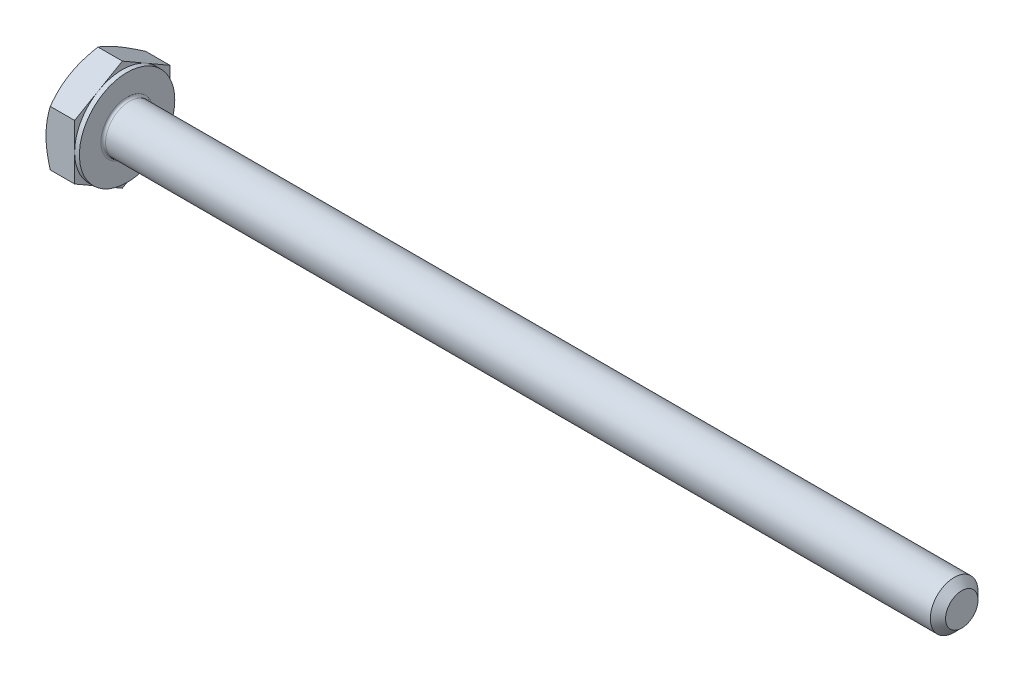
ISO-10303-21;
HEADER;
FILE_DESCRIPTION(('STEP AP214'),'2;1');
FILE_NAME('part.step','',(''),(''),'','','');
FILE_SCHEMA(('AUTOMOTIVE_DESIGN { 1 0 10303 214 1 1 1 1 }'));
ENDSEC;
DATA;
#1=APPLICATION_CONTEXT('core data for automotive mechanical design processes');
#2=APPLICATION_PROTOCOL_DEFINITION('international standard','automotive_design',2000,#1);
#3=PRODUCT_CONTEXT('',#1,'mechanical');
#4=PRODUCT('Part','Part','',(#3));
#5=PRODUCT_RELATED_PRODUCT_CATEGORY('part','',(#4));
#6=PRODUCT_DEFINITION_FORMATION('','',#4);
#7=PRODUCT_DEFINITION_CONTEXT('part definition',#1,'design');
#8=PRODUCT_DEFINITION('design','',#6,#7);
#9=PRODUCT_DEFINITION_SHAPE('','',#8);
#10=(LENGTH_UNIT() NAMED_UNIT(*) SI_UNIT(.MILLI.,.METRE.));
#11=(NAMED_UNIT(*) PLANE_ANGLE_UNIT() SI_UNIT($,.RADIAN.));
#12=(NAMED_UNIT(*) SI_UNIT($,.STERADIAN.) SOLID_ANGLE_UNIT());
#13=UNCERTAINTY_MEASURE_WITH_UNIT(LENGTH_MEASURE(1.E-05),#10,'distance_accuracy_value','');
#14=(GEOMETRIC_REPRESENTATION_CONTEXT(3) GLOBAL_UNCERTAINTY_ASSIGNED_CONTEXT((#13)) GLOBAL_UNIT_ASSIGNED_CONTEXT((#10,
#11,#12)) REPRESENTATION_CONTEXT('',''));
#15=CARTESIAN_POINT('',(0.,0.,0.));
#16=DIRECTION('',(0.,0.,1.));
#17=DIRECTION('',(1.,0.,0.));
#18=AXIS2_PLACEMENT_3D('',#15,#16,#17);
#19=CARTESIAN_POINT('',(1.4,1.15470053837925,-2.));
#20=DIRECTION('',(0.,-0.866025403784438,0.500000000000001));
#21=DIRECTION('',(0.,-0.500000000000001,-0.866025403784438));
#22=AXIS2_PLACEMENT_3D('',#19,#20,#21);
#23=PLANE('',#22);
#24=DIRECTION('',(0.,0.500000000000001,0.866025403784438));
#25=VECTOR('',#24,1.);
#26=CARTESIAN_POINT('',(1.2,1.15470053837925,-2.));
#27=LINE('',#26,#25);
#28=CARTESIAN_POINT('',(1.2,1.15470053837925,-2.));
#29=VERTEX_POINT('',#28);
#30=CARTESIAN_POINT('',(1.2,1.73205080756887,-1.));
#31=VERTEX_POINT('',#30);
#32=EDGE_CURVE('E174',#29,#31,#27,.T.);
#33=ORIENTED_EDGE('',*,*,#32,.F.);
#34=DIRECTION('',(-1.,0.,0.));
#35=VECTOR('',#34,1.);
#36=CARTESIAN_POINT('',(1.4,1.15470053837925,-2.));
#37=LINE('',#36,#35);
#38=CARTESIAN_POINT('',(0.178632794954079,1.15470053837925,-2.));
#39=VERTEX_POINT('',#38);
#40=EDGE_CURVE('E302',#29,#39,#37,.T.);
#41=ORIENTED_EDGE('',*,*,#40,.T.);
#42=CARTESIAN_POINT('',(0.178699466620498,2.30951654681234,0.000199999999999888));
#43=CARTESIAN_POINT('',(0.149389536100679,2.25877250251758,-0.0876912629000601));
#44=CARTESIAN_POINT('',(0.122732851980467,2.20759044065996,-0.176341194473591));
#45=CARTESIAN_POINT('',(0.0762024910207209,2.10433997494456,-0.355176246997802));
#46=CARTESIAN_POINT('',(0.0563452763827791,2.0522697359463,-0.445364546505036));
#47=CARTESIAN_POINT('',(0.0254334640232525,1.94877459684592,-0.624623385763305));
#48=CARTESIAN_POINT('',(0.0141731515985311,1.89736562427197,-0.713666338226303));
#49=CARTESIAN_POINT('',(0.000728662594641717,1.79430568008402,-0.892171397785042));
#50=CARTESIAN_POINT('',(-0.0014666450465321,1.74265508327244,-0.981632855703957));
#51=CARTESIAN_POINT('',(0.00309098933064816,1.64613626458981,-1.1488083535488));
#52=CARTESIAN_POINT('',(0.00872487468701375,1.60125362236172,-1.22654737026578));
#53=CARTESIAN_POINT('',(0.0265838952608275,1.51178075956051,-1.38151891453613));
#54=CARTESIAN_POINT('',(0.0388151360234386,1.46719084864821,-1.4587509057412));
#55=CARTESIAN_POINT('',(0.0693934368676089,1.37753338590959,-1.6140421864822));
#56=CARTESIAN_POINT('',(0.0878701670657147,1.33247718647009,-1.69208181310738));
#57=CARTESIAN_POINT('',(0.129805518212854,1.24303693915875,-1.84699686569213));
#58=CARTESIAN_POINT('',(0.153254280492312,1.1986517446858,-1.92387427762312));
#59=CARTESIAN_POINT('',(0.178699466620496,1.15458506832541,-2.0002));
#60=B_SPLINE_CURVE_WITH_KNOTS('',3,(#42,#43,#44,#45,#46,#47,#48,#49,#50,#51,#52,#53,#54,#55,#56,
#57,#58,#59),.UNSPECIFIED.,.F.,.F.,(4,2,2,2,2,2,2,2,4),(0.,0.31703182469561,0.634825876346563,
0.944753967652636,1.25430138000371,1.52387047293094,1.79368946861028,2.06949491027634,
2.34475850821472),.UNSPECIFIED.);
#61=CARTESIAN_POINT('',(0.,1.73205080756888,-1.));
#62=VERTEX_POINT('',#61);
#63=EDGE_CURVE('E229',#62,#39,#60,.T.);
#64=ORIENTED_EDGE('',*,*,#63,.F.);
#65=CARTESIAN_POINT('',(0.178632794954081,2.3094010767585,0.));
#66=VERTEX_POINT('',#65);
#67=EDGE_CURVE('E65',#66,#62,#60,.T.);
#68=ORIENTED_EDGE('',*,*,#67,.F.);
#69=DIRECTION('',(-1.,0.,0.));
#70=VECTOR('',#69,1.);
#71=CARTESIAN_POINT('',(1.4,2.3094010767585,0.));
#72=LINE('',#71,#70);
#73=CARTESIAN_POINT('',(1.2,2.3094010767585,0.));
#74=VERTEX_POINT('',#73);
#75=EDGE_CURVE('E294',#74,#66,#72,.T.);
#76=ORIENTED_EDGE('',*,*,#75,.F.);
#77=EDGE_CURVE('E172',#31,#74,#27,.T.);
#78=ORIENTED_EDGE('',*,*,#77,.F.);
#79=EDGE_LOOP('',(#33,#41,#64,#68,#76,#78));
#80=FACE_BOUND('',#79,.T.);
#81=ADVANCED_FACE('F42',(#80),#23,.F.);
#82=CARTESIAN_POINT('',(1.4,2.3094010767585,0.));
#83=DIRECTION('',(0.,-0.866025403784439,-0.5));
#84=DIRECTION('',(0.,0.5,-0.866025403784439));
#85=AXIS2_PLACEMENT_3D('',#82,#83,#84);
#86=PLANE('',#85);
#87=DIRECTION('',(0.,-0.5,0.866025403784439));
#88=VECTOR('',#87,1.);
#89=CARTESIAN_POINT('',(1.2,2.3094010767585,0.));
#90=LINE('',#89,#88);
#91=CARTESIAN_POINT('',(1.2,1.73205080756888,0.999999999999999));
#92=VERTEX_POINT('',#91);
#93=EDGE_CURVE('E171',#74,#92,#90,.T.);
#94=ORIENTED_EDGE('',*,*,#93,.F.);
#95=ORIENTED_EDGE('',*,*,#75,.T.);
#96=CARTESIAN_POINT('',(0.178699466620498,1.15458506832541,2.0002));
#97=CARTESIAN_POINT('',(0.149389536100679,1.20532911262018,1.91230873709994));
#98=CARTESIAN_POINT('',(0.122732851980467,1.2565111744778,1.82365880552641));
#99=CARTESIAN_POINT('',(0.0762024910207217,1.35976164019319,1.6448237530022));
#100=CARTESIAN_POINT('',(0.0563452763827798,1.41183187919145,1.55463545349497));
#101=CARTESIAN_POINT('',(0.0254334640232532,1.51532701829183,1.3753766142367));
#102=CARTESIAN_POINT('',(0.0141731515985318,1.56673599086578,1.2863336617737));
#103=CARTESIAN_POINT('',(0.000728662594642297,1.66979593505373,1.10782860221496));
#104=CARTESIAN_POINT('',(-0.00146664504653159,1.72144653186531,1.01836714429604));
#105=CARTESIAN_POINT('',(0.00309098933064883,1.81796535054794,0.851191646451204));
#106=CARTESIAN_POINT('',(0.00872487468701462,1.86284799277603,0.773452629734218));
#107=CARTESIAN_POINT('',(0.0265838952608284,1.95232085557725,0.618481085463868));
#108=CARTESIAN_POINT('',(0.0388151360234394,1.99691076648954,0.541249094258803));
#109=CARTESIAN_POINT('',(0.0693934368676098,2.08656822922816,0.3859578135178));
#110=CARTESIAN_POINT('',(0.0878701670657158,2.13162442866767,0.307918186892621));
#111=CARTESIAN_POINT('',(0.129805518212856,2.221064675979,0.153003134307866));
#112=CARTESIAN_POINT('',(0.153254280492313,2.26544987045196,0.0761257223768801));
#113=CARTESIAN_POINT('',(0.178699466620498,2.30951654681234,-0.000200000000000237));
#114=B_SPLINE_CURVE_WITH_KNOTS('',3,(#96,#97,#98,#99,#100,#101,#102,#103,#104,#105,#106,#107,
#108,#109,#110,#111,#112,#113),.UNSPECIFIED.,.F.,.F.,(4,2,2,2,2,2,2,2,4),(0.,0.31703182469561,
0.634825876346563,0.944753967652636,1.25430138000371,1.52387047293094,1.79368946861028,
2.06949491027634,2.34475850821473),.UNSPECIFIED.);
#115=CARTESIAN_POINT('',(0.,1.73205080756888,1.));
#116=VERTEX_POINT('',#115);
#117=EDGE_CURVE('E226',#116,#66,#114,.T.);
#118=ORIENTED_EDGE('',*,*,#117,.F.);
#119=CARTESIAN_POINT('',(0.178632794954081,1.15470053837925,2.));
#120=VERTEX_POINT('',#119);
#121=EDGE_CURVE('E240',#120,#116,#114,.T.);
#122=ORIENTED_EDGE('',*,*,#121,.F.);
#123=DIRECTION('',(-1.,0.,0.));
#124=VECTOR('',#123,1.);
#125=CARTESIAN_POINT('',(1.4,1.15470053837925,2.));
#126=LINE('',#125,#124);
#127=CARTESIAN_POINT('',(1.2,1.15470053837925,2.));
#128=VERTEX_POINT('',#127);
#129=EDGE_CURVE('E296',#128,#120,#126,.T.);
#130=ORIENTED_EDGE('',*,*,#129,.F.);
#131=EDGE_CURVE('E139',#92,#128,#90,.T.);
#132=ORIENTED_EDGE('',*,*,#131,.F.);
#133=EDGE_LOOP('',(#94,#95,#118,#122,#130,#132));
#134=FACE_BOUND('',#133,.T.);
#135=ADVANCED_FACE('F247',(#134),#86,.F.);
#136=CARTESIAN_POINT('',(1.4,1.15470053837925,2.));
#137=DIRECTION('',(0.,0.,-1.));
#138=DIRECTION('',(0.,1.,0.));
#139=AXIS2_PLACEMENT_3D('',#136,#137,#138);
#140=PLANE('',#139);
#141=DIRECTION('',(0.,-1.,0.));
#142=VECTOR('',#141,1.);
#143=CARTESIAN_POINT('',(1.2,1.15470053837925,2.));
#144=LINE('',#143,#142);
#145=CARTESIAN_POINT('',(1.2,0.,2.));
#146=VERTEX_POINT('',#145);
#147=EDGE_CURVE('E133',#128,#146,#144,.T.);
#148=ORIENTED_EDGE('',*,*,#147,.F.);
#149=ORIENTED_EDGE('',*,*,#129,.T.);
#150=CARTESIAN_POINT('',(0.992419852392982,-3.13534334920592,2.));
#151=CARTESIAN_POINT('',(0.949766074942452,-3.04769056829749,2.));
#152=CARTESIAN_POINT('',(0.907511692808824,-2.95984013223976,2.));
#153=CARTESIAN_POINT('',(0.824025729603062,-2.78363894197649,2.));
#154=CARTESIAN_POINT('',(0.782794303443193,-2.69528811445209,2.));
#155=CARTESIAN_POINT('',(0.701378042822358,-2.51754201402013,2.));
#156=CARTESIAN_POINT('',(0.661199840909808,-2.42814369282565,2.));
#157=CARTESIAN_POINT('',(0.58244361956385,-2.24864756301656,2.));
#158=CARTESIAN_POINT('',(0.543865526667035,-2.15854978674095,2.));
#159=CARTESIAN_POINT('',(0.467477454516517,-1.97449121004057,2.));
#160=CARTESIAN_POINT('',(0.42973602915364,-1.88050180573376,2.));
#161=CARTESIAN_POINT('',(0.35703646631785,-1.69145457253652,2.));
#162=CARTESIAN_POINT('',(0.322078084157467,-1.596396838415,2.));
#163=CARTESIAN_POINT('',(0.255825829385385,-1.40520112606372,2.));
#164=CARTESIAN_POINT('',(0.224525175838928,-1.30906552085766,2.));
#165=CARTESIAN_POINT('',(0.166574285524784,-1.11541575812431,2.));
#166=CARTESIAN_POINT('',(0.139922619737045,-1.0179020342057,2.));
#167=CARTESIAN_POINT('',(0.0926670884586287,-0.821976174576915,2.));
#168=CARTESIAN_POINT('',(0.0720299350207143,-0.723572216870586,2.));
#169=CARTESIAN_POINT('',(0.0379489989289781,-0.525507010432772,2.));
#170=CARTESIAN_POINT('',(0.0245044551886892,-0.425845895870196,2.));
#171=CARTESIAN_POINT('',(0.00605918304995842,-0.227075895397201,2.));
#172=CARTESIAN_POINT('',(0.000947242967010945,-0.127977630591756,2.));
#173=CARTESIAN_POINT('',(-0.000707077887514755,0.0702888236132123,2.));
#174=CARTESIAN_POINT('',(0.00275069729381066,0.169457014252423,2.));
#175=CARTESIAN_POINT('',(0.0208712519304511,0.405340988490246,2.));
#176=CARTESIAN_POINT('',(0.0393457318861218,0.541766414510007,2.));
#177=CARTESIAN_POINT('',(0.0893685197994817,0.812197876144569,2.));
#178=CARTESIAN_POINT('',(0.120928863305863,0.946201565685117,2.));
#179=CARTESIAN_POINT('',(0.194491535617742,1.21460196966574,2.));
#180=CARTESIAN_POINT('',(0.236719970265049,1.34893513055198,2.));
#181=CARTESIAN_POINT('',(0.305342715634523,1.54855280827295,2.));
#182=CARTESIAN_POINT('',(0.329094814119826,1.61477300040206,2.));
#183=CARTESIAN_POINT('',(0.378083109535134,1.74666219864761,2.));
#184=CARTESIAN_POINT('',(0.403319275219613,1.81233121633525,2.));
#185=CARTESIAN_POINT('',(0.471931369020591,1.98595823315488,2.));
#186=CARTESIAN_POINT('',(0.516378893864484,2.0934917068799,2.));
#187=CARTESIAN_POINT('',(0.60780685235865,2.30748039158346,2.));
#188=CARTESIAN_POINT('',(0.654787535582239,2.41393549508634,2.));
#189=CARTESIAN_POINT('',(0.750691733326186,2.62600576932006,2.));
#190=CARTESIAN_POINT('',(0.7996158757145,2.73162065515799,2.));
#191=CARTESIAN_POINT('',(0.898959617946037,2.94214604487009,2.));
#192=CARTESIAN_POINT('',(0.949379260936712,3.04705652831389,2.));
#193=CARTESIAN_POINT('',(1.10253125999265,3.36124828938023,2.));
#194=CARTESIAN_POINT('',(1.20701228526575,3.56967612984382,2.));
#195=CARTESIAN_POINT('',(1.41892202669915,3.98496524032843,2.));
#196=CARTESIAN_POINT('',(1.52635016650726,4.19182680670207,2.));
#197=CARTESIAN_POINT('',(1.73210073307885,4.58330895823095,2.));
#198=CARTESIAN_POINT('',(1.83022614170404,4.76803327054287,2.));
#199=CARTESIAN_POINT('',(2.02767337953705,5.13685390688514,2.));
#200=CARTESIAN_POINT('',(2.12699527691484,5.32095019435963,2.));
#201=CARTESIAN_POINT('',(2.32620881896864,5.68806820502982,2.));
#202=CARTESIAN_POINT('',(2.42609760695316,5.87109148023864,2.));
#203=CARTESIAN_POINT('',(2.62655964456527,6.23674517628736,2.));
#204=CARTESIAN_POINT('',(2.7271328424871,6.41937562546217,2.));
#205=CARTESIAN_POINT('',(2.82795563819849,6.6018672103049,2.));
#206=B_SPLINE_CURVE_WITH_KNOTS('',3,(#150,#151,#152,#153,#154,#155,#156,#157,#158,#159,#160,
#161,#162,#163,#164,#165,#166,#167,#168,#169,#170,#171,#172,#173,#174,#175,#176,#177,#178,#179,
#180,#181,#182,#183,#184,#185,#186,#187,#188,#189,#190,#191,#192,#193,#194,#195,#196,#197,#198,
#199,#200,#201,#202,#203,#204,#205),.UNSPECIFIED.,.F.,.F.,(4,2,2,2,2,2,2,2,2,2,2,2,2,2,2,2,2,2,
2,2,2,2,2,2,2,2,2,4),(0.,0.292443482095219,0.584930983609019,0.878954341193855,1.17296418474842,
1.47678188537141,1.78057284452145,2.08379136846026,2.38691652328999,2.68833067390679,
2.98971292405391,3.28703880406594,3.58437009489658,3.99653270008007,4.40907523018127,
4.83122730562908,5.04226871216917,5.25330567703647,5.60233094865879,5.95139067021083,
6.30056409357261,6.64974760093362,7.34915049068978,8.04841756336536,8.67591854313499,
9.30345544548481,9.92897567862432,10.5544491683195),.UNSPECIFIED.);
#207=CARTESIAN_POINT('',(0.,0.,2.));
#208=VERTEX_POINT('',#207);
#209=EDGE_CURVE('E241',#208,#120,#206,.T.);
#210=ORIENTED_EDGE('',*,*,#209,.F.);
#211=CARTESIAN_POINT('',(0.178632794954083,-1.15470053837925,2.));
#212=VERTEX_POINT('',#211);
#213=EDGE_CURVE('E303',#212,#208,#206,.T.);
#214=ORIENTED_EDGE('',*,*,#213,.F.);
#215=DIRECTION('',(-1.,0.,0.));
#216=VECTOR('',#215,1.);
#217=CARTESIAN_POINT('',(1.4,-1.15470053837925,2.));
#218=LINE('',#217,#216);
#219=CARTESIAN_POINT('',(1.2,-1.15470053837925,2.));
#220=VERTEX_POINT('',#219);
#221=EDGE_CURVE('E165',#220,#212,#218,.T.);
#222=ORIENTED_EDGE('',*,*,#221,.F.);
#223=EDGE_CURVE('E143',#146,#220,#144,.T.);
#224=ORIENTED_EDGE('',*,*,#223,.F.);
#225=EDGE_LOOP('',(#148,#149,#210,#214,#222,#224));
#226=FACE_BOUND('',#225,.T.);
#227=ADVANCED_FACE('F163',(#226),#140,.F.);
#228=CARTESIAN_POINT('',(1.4,-2.30940107675851,0.));
#229=DIRECTION('',(0.,0.866025403784438,-0.500000000000001));
#230=DIRECTION('',(0.,0.500000000000001,0.866025403784438));
#231=AXIS2_PLACEMENT_3D('',#228,#229,#230);
#232=PLANE('',#231);
#233=DIRECTION('',(0.,-0.500000000000001,-0.866025403784438));
#234=VECTOR('',#233,1.);
#235=CARTESIAN_POINT('',(1.2,-2.30940107675851,0.));
#236=LINE('',#235,#234);
#237=CARTESIAN_POINT('',(1.2,-1.73205080756887,1.));
#238=VERTEX_POINT('',#237);
#239=EDGE_CURVE('E150',#220,#238,#236,.T.);
#240=ORIENTED_EDGE('',*,*,#239,.F.);
#241=ORIENTED_EDGE('',*,*,#221,.T.);
#242=CARTESIAN_POINT('',(0.178699466620503,-2.30951654681235,-0.000200000000000486));
#243=CARTESIAN_POINT('',(0.149389536100683,-2.25877250251758,0.0876912629000598));
#244=CARTESIAN_POINT('',(0.122732851980471,-2.20759044065996,0.176341194473591));
#245=CARTESIAN_POINT('',(0.0762024910207252,-2.10433997494457,0.355176246997803));
#246=CARTESIAN_POINT('',(0.0563452763827833,-2.05226973594631,0.445364546505037));
#247=CARTESIAN_POINT('',(0.0254334640232565,-1.94877459684593,0.624623385763307));
#248=CARTESIAN_POINT('',(0.014173151598535,-1.89736562427198,0.713666338226305));
#249=CARTESIAN_POINT('',(0.000728662594645439,-1.79430568008403,0.892171397785045));
#250=CARTESIAN_POINT('',(-0.00146664504652836,-1.74265508327245,0.98163285570396));
#251=CARTESIAN_POINT('',(0.00309098933065205,-1.64613626458982,1.1488083535488));
#252=CARTESIAN_POINT('',(0.00872487468701775,-1.60125362236173,1.22654737026579));
#253=CARTESIAN_POINT('',(0.0265838952608314,-1.51178075956051,1.38151891453614));
#254=CARTESIAN_POINT('',(0.0388151360234424,-1.46719084864822,1.4587509057412));
#255=CARTESIAN_POINT('',(0.0693934368676126,-1.3775333859096,1.6140421864822));
#256=CARTESIAN_POINT('',(0.0878701670657185,-1.33247718647009,1.69208181310738));
#257=CARTESIAN_POINT('',(0.129805518212858,-1.24303693915876,1.84699686569214));
#258=CARTESIAN_POINT('',(0.153254280492316,-1.1986517446858,1.92387427762312));
#259=CARTESIAN_POINT('',(0.1786994666205,-1.15458506832542,2.0002));
#260=B_SPLINE_CURVE_WITH_KNOTS('',3,(#242,#243,#244,#245,#246,#247,#248,#249,#250,#251,#252,
#253,#254,#255,#256,#257,#258,#259),.UNSPECIFIED.,.F.,.F.,(4,2,2,2,2,2,2,2,4),(0.,
0.317031824695611,0.634825876346566,0.944753967652639,1.25430138000372,1.52387047293094,
1.79368946861029,2.06949491027634,2.34475850821473),.UNSPECIFIED.);
#261=CARTESIAN_POINT('',(0.,-1.73205080756888,1.));
#262=VERTEX_POINT('',#261);
#263=EDGE_CURVE('E228',#262,#212,#260,.T.);
#264=ORIENTED_EDGE('',*,*,#263,.F.);
#265=CARTESIAN_POINT('',(0.178632794954086,-2.30940107675851,0.));
#266=VERTEX_POINT('',#265);
#267=EDGE_CURVE('E220',#266,#262,#260,.T.);
#268=ORIENTED_EDGE('',*,*,#267,.F.);
#269=DIRECTION('',(-1.,0.,0.));
#270=VECTOR('',#269,1.);
#271=CARTESIAN_POINT('',(1.4,-2.30940107675851,0.));
#272=LINE('',#271,#270);
#273=CARTESIAN_POINT('',(1.2,-2.30940107675851,0.));
#274=VERTEX_POINT('',#273);
#275=EDGE_CURVE('E299',#274,#266,#272,.T.);
#276=ORIENTED_EDGE('',*,*,#275,.F.);
#277=EDGE_CURVE('E166',#238,#274,#236,.T.);
#278=ORIENTED_EDGE('',*,*,#277,.F.);
#279=EDGE_LOOP('',(#240,#241,#264,#268,#276,#278));
#280=FACE_BOUND('',#279,.T.);
#281=ADVANCED_FACE('F211',(#280),#232,.F.);
#282=CARTESIAN_POINT('',(1.4,-1.15470053837926,-2.));
#283=DIRECTION('',(0.,0.866025403784438,0.500000000000002));
#284=DIRECTION('',(0.,-0.500000000000002,0.866025403784438));
#285=AXIS2_PLACEMENT_3D('',#282,#283,#284);
#286=PLANE('',#285);
#287=DIRECTION('',(0.,0.500000000000002,-0.866025403784438));
#288=VECTOR('',#287,1.);
#289=CARTESIAN_POINT('',(1.2,-1.15470053837926,-2.));
#290=LINE('',#289,#288);
#291=CARTESIAN_POINT('',(1.2,-1.73205080756887,-1.));
#292=VERTEX_POINT('',#291);
#293=EDGE_CURVE('E349',#274,#292,#290,.T.);
#294=ORIENTED_EDGE('',*,*,#293,.F.);
#295=ORIENTED_EDGE('',*,*,#275,.T.);
#296=CARTESIAN_POINT('',(0.178699466620499,-1.15458506832542,-2.0002));
#297=CARTESIAN_POINT('',(0.14938953610068,-1.20532911262018,-1.91230873709994));
#298=CARTESIAN_POINT('',(0.122732851980468,-1.2565111744778,-1.82365880552641));
#299=CARTESIAN_POINT('',(0.0762024910207231,-1.3597616401932,-1.6448237530022));
#300=CARTESIAN_POINT('',(0.0563452763827814,-1.41183187919146,-1.55463545349496));
#301=CARTESIAN_POINT('',(0.0254334640232553,-1.51532701829184,-1.37537661423669));
#302=CARTESIAN_POINT('',(0.0141731515985342,-1.56673599086579,-1.2863336617737));
#303=CARTESIAN_POINT('',(0.000728662594645242,-1.66979593505374,-1.10782860221496));
#304=CARTESIAN_POINT('',(-0.00146664504652837,-1.72144653186532,-1.01836714429604));
#305=CARTESIAN_POINT('',(0.00309098933065253,-1.81796535054795,-0.851191646451202));
#306=CARTESIAN_POINT('',(0.00872487468701853,-1.86284799277604,-0.773452629734217));
#307=CARTESIAN_POINT('',(0.0265838952608326,-1.95232085557726,-0.618481085463867));
#308=CARTESIAN_POINT('',(0.0388151360234437,-1.99691076648955,-0.541249094258802));
#309=CARTESIAN_POINT('',(0.0693934368676144,-2.08656822922817,-0.3859578135178));
#310=CARTESIAN_POINT('',(0.0878701670657206,-2.13162442866768,-0.307918186892621));
#311=CARTESIAN_POINT('',(0.129805518212861,-2.22106467597901,-0.153003134307866));
#312=CARTESIAN_POINT('',(0.153254280492318,-2.26544987045197,-0.0761257223768801));
#313=CARTESIAN_POINT('',(0.178699466620503,-2.30951654681235,0.000199999999999866));
#314=B_SPLINE_CURVE_WITH_KNOTS('',3,(#296,#297,#298,#299,#300,#301,#302,#303,#304,#305,#306,
#307,#308,#309,#310,#311,#312,#313),.UNSPECIFIED.,.F.,.F.,(4,2,2,2,2,2,2,2,4),(0.,
0.31703182469561,0.634825876346564,0.944753967652636,1.25430138000371,1.52387047293094,
1.79368946861028,2.06949491027634,2.34475850821473),.UNSPECIFIED.);
#315=CARTESIAN_POINT('',(0.,-1.73205080756888,-1.));
#316=VERTEX_POINT('',#315);
#317=EDGE_CURVE('E227',#316,#266,#314,.T.);
#318=ORIENTED_EDGE('',*,*,#317,.F.);
#319=CARTESIAN_POINT('',(0.178632794953992,-1.15470053837939,-2.));
#320=VERTEX_POINT('',#319);
#321=EDGE_CURVE('E188',#320,#316,#314,.T.);
#322=ORIENTED_EDGE('',*,*,#321,.F.);
#323=DIRECTION('',(-1.,0.,0.));
#324=VECTOR('',#323,1.);
#325=CARTESIAN_POINT('',(1.4,-1.15470053837926,-2.));
#326=LINE('',#325,#324);
#327=CARTESIAN_POINT('',(1.2,-1.15470053837926,-2.));
#328=VERTEX_POINT('',#327);
#329=EDGE_CURVE('E301',#328,#320,#326,.T.);
#330=ORIENTED_EDGE('',*,*,#329,.F.);
#331=EDGE_CURVE('E161',#292,#328,#290,.T.);
#332=ORIENTED_EDGE('',*,*,#331,.F.);
#333=EDGE_LOOP('',(#294,#295,#318,#322,#330,#332));
#334=FACE_BOUND('',#333,.T.);
#335=ADVANCED_FACE('F204',(#334),#286,.F.);
#336=CARTESIAN_POINT('',(1.4,1.15470053837925,-2.));
#337=DIRECTION('',(0.,0.,1.));
#338=DIRECTION('',(0.,-1.,0.));
#339=AXIS2_PLACEMENT_3D('',#336,#337,#338);
#340=PLANE('',#339);
#341=DIRECTION('',(0.,1.,0.));
#342=VECTOR('',#341,1.);
#343=CARTESIAN_POINT('',(1.2,1.15470053837925,-2.));
#344=LINE('',#343,#342);
#345=CARTESIAN_POINT('',(1.2,0.,-2.));
#346=VERTEX_POINT('',#345);
#347=EDGE_CURVE('E273',#328,#346,#344,.T.);
#348=ORIENTED_EDGE('',*,*,#347,.F.);
#349=ORIENTED_EDGE('',*,*,#329,.T.);
#350=CARTESIAN_POINT('',(0.99241985239298,-3.13534334920592,-2.));
#351=CARTESIAN_POINT('',(0.949766074942451,-3.04769056829749,-2.));
#352=CARTESIAN_POINT('',(0.907511692808823,-2.95984013223976,-2.));
#353=CARTESIAN_POINT('',(0.824025729603061,-2.78363894197649,-2.));
#354=CARTESIAN_POINT('',(0.782794303443192,-2.69528811445209,-2.));
#355=CARTESIAN_POINT('',(0.701378042822357,-2.51754201402013,-2.));
#356=CARTESIAN_POINT('',(0.661199840909807,-2.42814369282565,-2.));
#357=CARTESIAN_POINT('',(0.58244361956385,-2.24864756301656,-2.));
#358=CARTESIAN_POINT('',(0.543865526667034,-2.15854978674095,-2.));
#359=CARTESIAN_POINT('',(0.467477454516516,-1.97449121004058,-2.));
#360=CARTESIAN_POINT('',(0.429736029153639,-1.88050180573376,-2.));
#361=CARTESIAN_POINT('',(0.357036466317849,-1.69145457253652,-2.));
#362=CARTESIAN_POINT('',(0.322078084157466,-1.596396838415,-2.));
#363=CARTESIAN_POINT('',(0.255825829385384,-1.40520112606372,-2.));
#364=CARTESIAN_POINT('',(0.224525175838927,-1.30906552085766,-2.));
#365=CARTESIAN_POINT('',(0.166574285524783,-1.11541575812431,-2.));
#366=CARTESIAN_POINT('',(0.139922619737044,-1.0179020342057,-2.));
#367=CARTESIAN_POINT('',(0.0926670884586274,-0.821976174576918,-2.));
#368=CARTESIAN_POINT('',(0.0720299350207129,-0.723572216870589,-2.));
#369=CARTESIAN_POINT('',(0.0379489989289765,-0.525507010432776,-2.));
#370=CARTESIAN_POINT('',(0.0245044551886875,-0.425845895870199,-2.));
#371=CARTESIAN_POINT('',(0.00605918304995657,-0.227075895397204,-2.));
#372=CARTESIAN_POINT('',(0.000947242967009018,-0.127977630591759,-2.));
#373=CARTESIAN_POINT('',(-0.000707077887516833,0.0702888236132091,-2.));
#374=CARTESIAN_POINT('',(0.0027506972938085,0.16945701425242,-2.));
#375=CARTESIAN_POINT('',(0.0208712519304487,0.405340988490242,-2.));
#376=CARTESIAN_POINT('',(0.0393457318861191,0.541766414510003,-2.));
#377=CARTESIAN_POINT('',(0.0893685197994784,0.812197876144564,-2.));
#378=CARTESIAN_POINT('',(0.120928863305859,0.946201565685111,-2.));
#379=CARTESIAN_POINT('',(0.194491535617739,1.21460196966573,-2.));
#380=CARTESIAN_POINT('',(0.236719970265045,1.34893513055198,-2.));
#381=CARTESIAN_POINT('',(0.305342715634519,1.54855280827295,-2.));
#382=CARTESIAN_POINT('',(0.329094814119821,1.61477300040205,-2.));
#383=CARTESIAN_POINT('',(0.37808310953513,1.74666219864761,-2.));
#384=CARTESIAN_POINT('',(0.403319275219608,1.81233121633524,-2.));
#385=CARTESIAN_POINT('',(0.471931369020586,1.98595823315487,-2.));
#386=CARTESIAN_POINT('',(0.516378893864479,2.09349170687989,-2.));
#387=CARTESIAN_POINT('',(0.607806852358645,2.30748039158346,-2.));
#388=CARTESIAN_POINT('',(0.654787535582233,2.41393549508633,-2.));
#389=CARTESIAN_POINT('',(0.75069173332618,2.62600576932005,-2.));
#390=CARTESIAN_POINT('',(0.799615875714494,2.73162065515798,-2.));
#391=CARTESIAN_POINT('',(0.898959617946031,2.94214604487008,-2.));
#392=CARTESIAN_POINT('',(0.949379260936707,3.04705652831388,-2.));
#393=CARTESIAN_POINT('',(1.10253125999265,3.36124828938022,-2.));
#394=CARTESIAN_POINT('',(1.20701228526574,3.56967612984381,-2.));
#395=CARTESIAN_POINT('',(1.41892202669914,3.98496524032842,-2.));
#396=CARTESIAN_POINT('',(1.52635016650726,4.19182680670206,-2.));
#397=CARTESIAN_POINT('',(1.73210073307885,4.58330895823094,-2.));
#398=CARTESIAN_POINT('',(1.83022614170404,4.76803327054286,-2.));
#399=CARTESIAN_POINT('',(2.02767337953705,5.13685390688513,-2.));
#400=CARTESIAN_POINT('',(2.12699527691484,5.32095019435962,-1.99999999999999));
#401=CARTESIAN_POINT('',(2.32620881896864,5.68806820502981,-1.99999999999999));
#402=CARTESIAN_POINT('',(2.42609760695315,5.87109148023863,-1.99999999999999));
#403=CARTESIAN_POINT('',(2.62655964456527,6.23674517628735,-1.99999999999999));
#404=CARTESIAN_POINT('',(2.7271328424871,6.41937562546217,-1.99999999999999));
#405=CARTESIAN_POINT('',(2.82795563819849,6.60186721030489,-1.99999999999999));
#406=B_SPLINE_CURVE_WITH_KNOTS('',3,(#350,#351,#352,#353,#354,#355,#356,#357,#358,#359,#360,
#361,#362,#363,#364,#365,#366,#367,#368,#369,#370,#371,#372,#373,#374,#375,#376,#377,#378,#379,
#380,#381,#382,#383,#384,#385,#386,#387,#388,#389,#390,#391,#392,#393,#394,#395,#396,#397,#398,
#399,#400,#401,#402,#403,#404,#405),.UNSPECIFIED.,.F.,.F.,(4,2,2,2,2,2,2,2,2,2,2,2,2,2,2,2,2,2,
2,2,2,2,2,2,2,2,2,4),(0.,0.292443482095218,0.584930983609017,0.878954341193854,1.17296418474842,
1.47678188537141,1.78057284452145,2.08379136846025,2.38691652328999,2.68833067390679,
2.98971292405391,3.28703880406594,3.58437009489658,3.99653270008006,4.40907523018127,
4.83122730562907,5.04226871216916,5.25330567703647,5.60233094865878,5.95139067021082,
6.3005640935726,6.64974760093361,7.34915049068977,8.04841756336535,8.67591854313498,
9.3034554454848,9.92897567862431,10.5544491683195),.UNSPECIFIED.);
#407=CARTESIAN_POINT('',(0.,0.,-2.));
#408=VERTEX_POINT('',#407);
#409=EDGE_CURVE('E178',#408,#320,#406,.F.);
#410=ORIENTED_EDGE('',*,*,#409,.F.);
#411=EDGE_CURVE('E187',#39,#408,#406,.F.);
#412=ORIENTED_EDGE('',*,*,#411,.F.);
#413=ORIENTED_EDGE('',*,*,#40,.F.);
#414=EDGE_CURVE('E277',#346,#29,#344,.T.);
#415=ORIENTED_EDGE('',*,*,#414,.F.);
#416=EDGE_LOOP('',(#348,#349,#410,#412,#413,#415));
#417=FACE_BOUND('',#416,.T.);
#418=ADVANCED_FACE('F199',(#417),#340,.F.);
#419=CARTESIAN_POINT('',(0.,0.,0.));
#420=DIRECTION('',(1.,0.,0.));
#421=DIRECTION('',(0.,0.,-1.));
#422=AXIS2_PLACEMENT_3D('',#419,#420,#421);
#423=CONICAL_SURFACE('',#422,2.,1.0471975511966);
#424=ORIENTED_EDGE('',*,*,#321,.T.);
#425=CARTESIAN_POINT('',(0.,0.,0.));
#426=DIRECTION('',(1.,0.,0.));
#427=DIRECTION('',(0.,0.,-1.));
#428=AXIS2_PLACEMENT_3D('',#425,#426,#427);
#429=CIRCLE('',#428,2.);
#430=EDGE_CURVE('E290',#316,#408,#429,.T.);
#431=ORIENTED_EDGE('',*,*,#430,.T.);
#432=ORIENTED_EDGE('',*,*,#409,.T.);
#433=EDGE_LOOP('',(#424,#431,#432));
#434=FACE_BOUND('',#433,.T.);
#435=ADVANCED_FACE('F203',(#434),#423,.T.);
#436=ORIENTED_EDGE('',*,*,#267,.T.);
#437=EDGE_CURVE('E293',#262,#316,#429,.T.);
#438=ORIENTED_EDGE('',*,*,#437,.T.);
#439=ORIENTED_EDGE('',*,*,#317,.T.);
#440=EDGE_LOOP('',(#436,#438,#439));
#441=FACE_BOUND('',#440,.T.);
#442=ADVANCED_FACE('F346',(#441),#423,.T.);
#443=ORIENTED_EDGE('',*,*,#213,.T.);
#444=EDGE_CURVE('E323',#208,#262,#429,.T.);
#445=ORIENTED_EDGE('',*,*,#444,.T.);
#446=ORIENTED_EDGE('',*,*,#263,.T.);
#447=EDGE_LOOP('',(#443,#445,#446));
#448=FACE_BOUND('',#447,.T.);
#449=ADVANCED_FACE('F195',(#448),#423,.T.);
#450=ORIENTED_EDGE('',*,*,#209,.T.);
#451=ORIENTED_EDGE('',*,*,#121,.T.);
#452=CARTESIAN_POINT('',(0.,0.,0.));
#453=DIRECTION('',(-1.,0.,0.));
#454=DIRECTION('',(0.,0.,1.));
#455=AXIS2_PLACEMENT_3D('',#452,#453,#454);
#456=CIRCLE('',#455,2.);
#457=EDGE_CURVE('E175',#208,#116,#456,.T.);
#458=ORIENTED_EDGE('',*,*,#457,.F.);
#459=EDGE_LOOP('',(#450,#451,#458));
#460=FACE_BOUND('',#459,.T.);
#461=ADVANCED_FACE('F317',(#460),#423,.T.);
#462=ORIENTED_EDGE('',*,*,#117,.T.);
#463=ORIENTED_EDGE('',*,*,#67,.T.);
#464=EDGE_CURVE('E288',#62,#116,#429,.T.);
#465=ORIENTED_EDGE('',*,*,#464,.T.);
#466=EDGE_LOOP('',(#462,#463,#465));
#467=FACE_BOUND('',#466,.T.);
#468=ADVANCED_FACE('F321',(#467),#423,.T.);
#469=ORIENTED_EDGE('',*,*,#63,.T.);
#470=ORIENTED_EDGE('',*,*,#411,.T.);
#471=EDGE_CURVE('E287',#408,#62,#429,.T.);
#472=ORIENTED_EDGE('',*,*,#471,.T.);
#473=EDGE_LOOP('',(#469,#470,#472));
#474=FACE_BOUND('',#473,.T.);
#475=ADVANCED_FACE('F337',(#474),#423,.T.);
#476=CARTESIAN_POINT('',(0.,0.,-3.99999999999999));
#477=DIRECTION('',(1.,0.,0.));
#478=DIRECTION('',(0.,0.,-1.));
#479=AXIS2_PLACEMENT_3D('',#476,#477,#478);
#480=PLANE('',#479);
#481=ORIENTED_EDGE('',*,*,#471,.F.);
#482=ORIENTED_EDGE('',*,*,#430,.F.);
#483=ORIENTED_EDGE('',*,*,#437,.F.);
#484=ORIENTED_EDGE('',*,*,#444,.F.);
#485=ORIENTED_EDGE('',*,*,#457,.T.);
#486=ORIENTED_EDGE('',*,*,#464,.F.);
#487=EDGE_LOOP('',(#481,#482,#483,#484,#485,#486));
#488=FACE_BOUND('',#487,.T.);
#489=ADVANCED_FACE('F206',(#488),#480,.F.);
#490=CARTESIAN_POINT('',(1.2,2.,0.));
#491=DIRECTION('',(1.,0.,0.));
#492=DIRECTION('',(0.,0.,-1.));
#493=AXIS2_PLACEMENT_3D('',#490,#491,#492);
#494=PLANE('',#493);
#495=ORIENTED_EDGE('',*,*,#32,.T.);
#496=CARTESIAN_POINT('',(1.2,0.,0.));
#497=DIRECTION('',(-1.,0.,0.));
#498=DIRECTION('',(0.,0.,1.));
#499=AXIS2_PLACEMENT_3D('',#496,#497,#498);
#500=CIRCLE('',#499,2.);
#501=EDGE_CURVE('E57',#31,#346,#500,.T.);
#502=ORIENTED_EDGE('',*,*,#501,.T.);
#503=ORIENTED_EDGE('',*,*,#414,.T.);
#504=EDGE_LOOP('',(#495,#502,#503));
#505=FACE_BOUND('',#504,.T.);
#506=ADVANCED_FACE('F355',(#505),#494,.T.);
#507=ORIENTED_EDGE('',*,*,#77,.T.);
#508=ORIENTED_EDGE('',*,*,#93,.T.);
#509=EDGE_CURVE('E160',#92,#31,#500,.T.);
#510=ORIENTED_EDGE('',*,*,#509,.T.);
#511=EDGE_LOOP('',(#507,#508,#510));
#512=FACE_BOUND('',#511,.T.);
#513=ADVANCED_FACE('F357',(#512),#494,.T.);
#514=ORIENTED_EDGE('',*,*,#131,.T.);
#515=ORIENTED_EDGE('',*,*,#147,.T.);
#516=EDGE_CURVE('E137',#146,#92,#500,.T.);
#517=ORIENTED_EDGE('',*,*,#516,.T.);
#518=EDGE_LOOP('',(#514,#515,#517));
#519=FACE_BOUND('',#518,.T.);
#520=ADVANCED_FACE('F135',(#519),#494,.T.);
#521=ORIENTED_EDGE('',*,*,#223,.T.);
#522=ORIENTED_EDGE('',*,*,#239,.T.);
#523=EDGE_CURVE('E147',#238,#146,#500,.T.);
#524=ORIENTED_EDGE('',*,*,#523,.T.);
#525=EDGE_LOOP('',(#521,#522,#524));
#526=FACE_BOUND('',#525,.T.);
#527=ADVANCED_FACE('F148',(#526),#494,.T.);
#528=ORIENTED_EDGE('',*,*,#277,.T.);
#529=ORIENTED_EDGE('',*,*,#293,.T.);
#530=EDGE_CURVE('E154',#292,#238,#500,.T.);
#531=ORIENTED_EDGE('',*,*,#530,.T.);
#532=EDGE_LOOP('',(#528,#529,#531));
#533=FACE_BOUND('',#532,.T.);
#534=ADVANCED_FACE('F371',(#533),#494,.T.);
#535=ORIENTED_EDGE('',*,*,#331,.T.);
#536=ORIENTED_EDGE('',*,*,#347,.T.);
#537=EDGE_CURVE('E354',#346,#292,#500,.T.);
#538=ORIENTED_EDGE('',*,*,#537,.T.);
#539=EDGE_LOOP('',(#535,#536,#538));
#540=FACE_BOUND('',#539,.T.);
#541=ADVANCED_FACE('F352',(#540),#494,.T.);
#542=CARTESIAN_POINT('',(0.,0.,0.));
#543=DIRECTION('',(-1.,0.,0.));
#544=DIRECTION('',(0.,0.,1.));
#545=AXIS2_PLACEMENT_3D('',#542,#543,#544);
#546=CYLINDRICAL_SURFACE('',#545,2.);
#547=ORIENTED_EDGE('',*,*,#501,.F.);
#548=ORIENTED_EDGE('',*,*,#509,.F.);
#549=ORIENTED_EDGE('',*,*,#516,.F.);
#550=ORIENTED_EDGE('',*,*,#523,.F.);
#551=ORIENTED_EDGE('',*,*,#530,.F.);
#552=ORIENTED_EDGE('',*,*,#537,.F.);
#553=EDGE_LOOP('',(#547,#548,#549,#550,#551,#552));
#554=FACE_BOUND('',#553,.T.);
#555=CARTESIAN_POINT('',(1.4,0.,0.));
#556=DIRECTION('',(1.,0.,0.));
#557=DIRECTION('',(0.,0.,-1.));
#558=AXIS2_PLACEMENT_3D('',#555,#556,#557);
#559=CIRCLE('',#558,2.);
#560=CARTESIAN_POINT('',(1.4,0.,-2.));
#561=VERTEX_POINT('',#560);
#562=EDGE_CURVE('E286',#561,#561,#559,.T.);
#563=ORIENTED_EDGE('',*,*,#562,.F.);
#564=EDGE_LOOP('',(#563));
#565=FACE_BOUND('',#564,.T.);
#566=ADVANCED_FACE('F157',(#554,#565),#546,.T.);
#567=CARTESIAN_POINT('',(36.4,0.,0.));
#568=DIRECTION('',(-1.,0.,0.));
#569=DIRECTION('',(0.,0.,1.));
#570=AXIS2_PLACEMENT_3D('',#567,#568,#569);
#571=PLANE('',#570);
#572=CARTESIAN_POINT('',(36.4,0.,0.));
#573=DIRECTION('',(-1.,0.,0.));
#574=DIRECTION('',(0.,0.,1.));
#575=AXIS2_PLACEMENT_3D('',#572,#573,#574);
#576=CIRCLE('',#575,0.679999999999997);
#577=CARTESIAN_POINT('',(36.4,0.,0.679999999999997));
#578=VERTEX_POINT('',#577);
#579=EDGE_CURVE('E268',#578,#578,#576,.F.);
#580=ORIENTED_EDGE('',*,*,#579,.T.);
#581=EDGE_LOOP('',(#580));
#582=FACE_BOUND('',#581,.T.);
#583=ADVANCED_FACE('F365',(#582),#571,.F.);
#584=CARTESIAN_POINT('',(0.,0.,0.));
#585=DIRECTION('',(-1.,0.,0.));
#586=DIRECTION('',(0.,0.,1.));
#587=AXIS2_PLACEMENT_3D('',#584,#585,#586);
#588=CYLINDRICAL_SURFACE('',#587,0.999999999999999);
#589=CARTESIAN_POINT('',(1.5,0.,0.));
#590=DIRECTION('',(1.,0.,0.));
#591=DIRECTION('',(0.,0.,-1.));
#592=AXIS2_PLACEMENT_3D('',#589,#590,#591);
#593=CIRCLE('',#592,0.999999999999999);
#594=CARTESIAN_POINT('',(1.5,0.,-0.999999999999999));
#595=VERTEX_POINT('',#594);
#596=EDGE_CURVE('E12',#595,#595,#593,.T.);
#597=ORIENTED_EDGE('',*,*,#596,.T.);
#598=EDGE_LOOP('',(#597));
#599=FACE_BOUND('',#598,.T.);
#600=CARTESIAN_POINT('',(36.08,0.,0.));
#601=DIRECTION('',(-1.,0.,0.));
#602=DIRECTION('',(0.,0.,1.));
#603=AXIS2_PLACEMENT_3D('',#600,#601,#602);
#604=CIRCLE('',#603,0.999999999999999);
#605=CARTESIAN_POINT('',(36.08,0.,0.999999999999999));
#606=VERTEX_POINT('',#605);
#607=EDGE_CURVE('E271',#606,#606,#604,.T.);
#608=ORIENTED_EDGE('',*,*,#607,.T.);
#609=EDGE_LOOP('',(#608));
#610=FACE_BOUND('',#609,.T.);
#611=ADVANCED_FACE('F263',(#599,#610),#588,.T.);
#612=CARTESIAN_POINT('',(1.4,0.,-3.99999999999999));
#613=DIRECTION('',(1.,0.,0.));
#614=DIRECTION('',(0.,0.,-1.));
#615=AXIS2_PLACEMENT_3D('',#612,#613,#614);
#616=PLANE('',#615);
#617=CARTESIAN_POINT('',(1.4,0.,0.));
#618=DIRECTION('',(1.,0.,0.));
#619=DIRECTION('',(0.,0.,-1.));
#620=AXIS2_PLACEMENT_3D('',#617,#618,#619);
#621=CIRCLE('',#620,1.1);
#622=CARTESIAN_POINT('',(1.4,0.,-1.1));
#623=VERTEX_POINT('',#622);
#624=EDGE_CURVE('E50',#623,#623,#621,.F.);
#625=ORIENTED_EDGE('',*,*,#624,.T.);
#626=EDGE_LOOP('',(#625));
#627=FACE_BOUND('',#626,.T.);
#628=ORIENTED_EDGE('',*,*,#562,.T.);
#629=EDGE_LOOP('',(#628));
#630=FACE_BOUND('',#629,.T.);
#631=ADVANCED_FACE('F256',(#627,#630),#616,.T.);
#632=CARTESIAN_POINT('',(36.08,0.,0.));
#633=DIRECTION('',(-1.,0.,0.));
#634=DIRECTION('',(0.,0.,1.));
#635=AXIS2_PLACEMENT_3D('',#632,#633,#634);
#636=CONICAL_SURFACE('',#635,0.999999999999999,0.78539816339745);
#637=ORIENTED_EDGE('',*,*,#579,.F.);
#638=EDGE_LOOP('',(#637));
#639=FACE_BOUND('',#638,.T.);
#640=ORIENTED_EDGE('',*,*,#607,.F.);
#641=EDGE_LOOP('',(#640));
#642=FACE_BOUND('',#641,.T.);
#643=ADVANCED_FACE('F254',(#639,#642),#636,.T.);
#644=CARTESIAN_POINT('',(1.5,0.,0.));
#645=DIRECTION('',(1.,0.,0.));
#646=DIRECTION('',(0.,0.,-1.));
#647=AXIS2_PLACEMENT_3D('',#644,#645,#646);
#648=TOROIDAL_SURFACE('',#647,1.1,0.1);
#649=ORIENTED_EDGE('',*,*,#596,.F.);
#650=EDGE_LOOP('',(#649));
#651=FACE_BOUND('',#650,.T.);
#652=ORIENTED_EDGE('',*,*,#624,.F.);
#653=EDGE_LOOP('',(#652));
#654=FACE_BOUND('',#653,.T.);
#655=ADVANCED_FACE('F44',(#651,#654),#648,.F.);
#656=CLOSED_SHELL('',(#81,#135,#227,#281,#335,#418,#435,#442,#449,#461,#468,#475,#489,#506,#513,
#520,#527,#534,#541,#566,#583,#611,#631,#643,#655));
#657=MANIFOLD_SOLID_BREP('B2',#656);
#658=ADVANCED_BREP_SHAPE_REPRESENTATION('',(#18,#657),#14);
#659=SHAPE_DEFINITION_REPRESENTATION(#9,#658);
ENDSEC;
END-ISO-10303-21;
